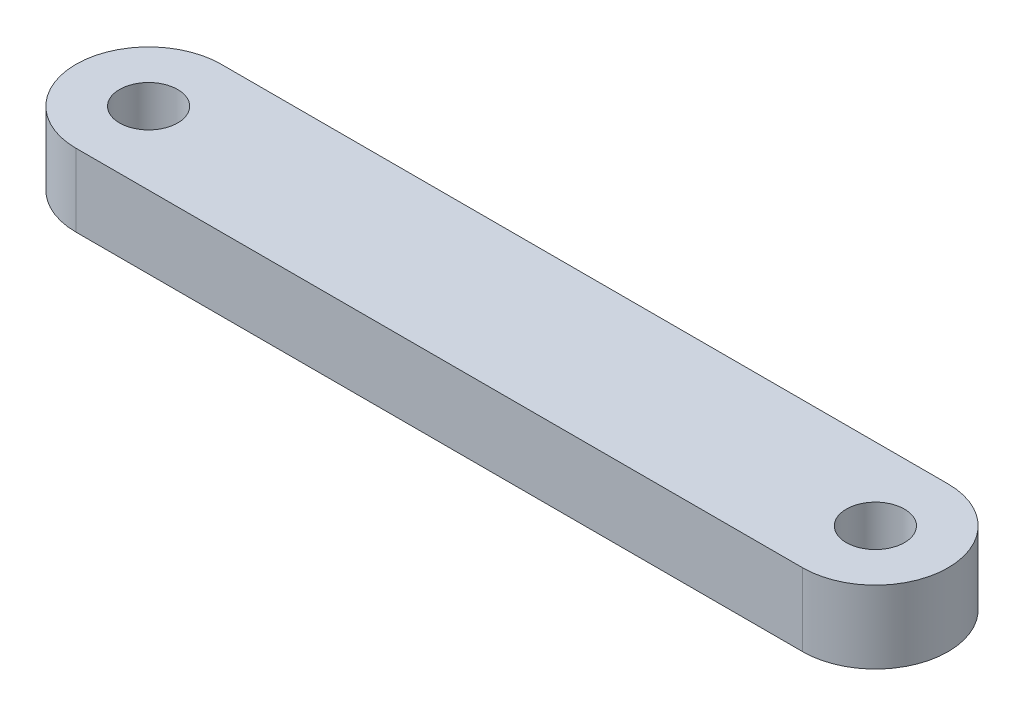
ISO-10303-21;
HEADER;
FILE_DESCRIPTION(('STEP AP214'),'2;1');
FILE_NAME('part.step','',(''),(''),'','','');
FILE_SCHEMA(('AUTOMOTIVE_DESIGN { 1 0 10303 214 1 1 1 1 }'));
ENDSEC;
DATA;
#1=APPLICATION_CONTEXT('core data for automotive mechanical design processes');
#2=APPLICATION_PROTOCOL_DEFINITION('international standard','automotive_design',2000,#1);
#3=PRODUCT_CONTEXT('',#1,'mechanical');
#4=PRODUCT('Part','Part','',(#3));
#5=PRODUCT_RELATED_PRODUCT_CATEGORY('part','',(#4));
#6=PRODUCT_DEFINITION_FORMATION('','',#4);
#7=PRODUCT_DEFINITION_CONTEXT('part definition',#1,'design');
#8=PRODUCT_DEFINITION('design','',#6,#7);
#9=PRODUCT_DEFINITION_SHAPE('','',#8);
#10=(LENGTH_UNIT() NAMED_UNIT(*) SI_UNIT(.MILLI.,.METRE.));
#11=(NAMED_UNIT(*) PLANE_ANGLE_UNIT() SI_UNIT($,.RADIAN.));
#12=(NAMED_UNIT(*) SI_UNIT($,.STERADIAN.) SOLID_ANGLE_UNIT());
#13=UNCERTAINTY_MEASURE_WITH_UNIT(LENGTH_MEASURE(1.E-05),#10,'distance_accuracy_value','');
#14=(GEOMETRIC_REPRESENTATION_CONTEXT(3) GLOBAL_UNCERTAINTY_ASSIGNED_CONTEXT((#13)) GLOBAL_UNIT_ASSIGNED_CONTEXT((#10,
#11,#12)) REPRESENTATION_CONTEXT('',''));
#15=CARTESIAN_POINT('',(0.,0.,0.));
#16=DIRECTION('',(0.,0.,1.));
#17=DIRECTION('',(1.,0.,0.));
#18=AXIS2_PLACEMENT_3D('',#15,#16,#17);
#19=CARTESIAN_POINT('',(0.,5.,-5.));
#20=DIRECTION('',(0.,-1.,0.));
#21=DIRECTION('',(0.,0.,-1.));
#22=AXIS2_PLACEMENT_3D('',#19,#20,#21);
#23=CYLINDRICAL_SURFACE('',#22,5.);
#24=CARTESIAN_POINT('',(0.,0.,-5.));
#25=DIRECTION('',(0.,1.,0.));
#26=DIRECTION('',(0.,0.,1.));
#27=AXIS2_PLACEMENT_3D('',#24,#25,#26);
#28=CIRCLE('',#27,5.);
#29=CARTESIAN_POINT('',(0.,0.,-10.));
#30=VERTEX_POINT('',#29);
#31=CARTESIAN_POINT('',(0.,0.,0.));
#32=VERTEX_POINT('',#31);
#33=EDGE_CURVE('E100',#30,#32,#28,.T.);
#34=ORIENTED_EDGE('',*,*,#33,.T.);
#35=DIRECTION('',(0.,-1.,0.));
#36=VECTOR('',#35,1.);
#37=CARTESIAN_POINT('',(0.,5.,0.));
#38=LINE('',#37,#36);
#39=CARTESIAN_POINT('',(0.,5.,0.));
#40=VERTEX_POINT('',#39);
#41=EDGE_CURVE('E11',#40,#32,#38,.T.);
#42=ORIENTED_EDGE('',*,*,#41,.F.);
#43=CARTESIAN_POINT('',(0.,5.,-5.));
#44=DIRECTION('',(0.,1.,0.));
#45=DIRECTION('',(0.,0.,1.));
#46=AXIS2_PLACEMENT_3D('',#43,#44,#45);
#47=CIRCLE('',#46,5.);
#48=CARTESIAN_POINT('',(0.,5.,-10.));
#49=VERTEX_POINT('',#48);
#50=EDGE_CURVE('E88',#49,#40,#47,.T.);
#51=ORIENTED_EDGE('',*,*,#50,.F.);
#52=DIRECTION('',(0.,-1.,0.));
#53=VECTOR('',#52,1.);
#54=CARTESIAN_POINT('',(0.,5.,-10.));
#55=LINE('',#54,#53);
#56=EDGE_CURVE('E96',#49,#30,#55,.T.);
#57=ORIENTED_EDGE('',*,*,#56,.T.);
#58=EDGE_LOOP('',(#34,#42,#51,#57));
#59=FACE_BOUND('',#58,.T.);
#60=ADVANCED_FACE('F37',(#59),#23,.T.);
#61=CARTESIAN_POINT('',(0.,5.,0.));
#62=DIRECTION('',(0.,0.,-1.));
#63=DIRECTION('',(-1.,0.,0.));
#64=AXIS2_PLACEMENT_3D('',#61,#62,#63);
#65=PLANE('',#64);
#66=DIRECTION('',(1.,0.,0.));
#67=VECTOR('',#66,1.);
#68=CARTESIAN_POINT('',(0.,0.,0.));
#69=LINE('',#68,#67);
#70=CARTESIAN_POINT('',(50.,0.,0.));
#71=VERTEX_POINT('',#70);
#72=EDGE_CURVE('E92',#32,#71,#69,.T.);
#73=ORIENTED_EDGE('',*,*,#72,.T.);
#74=DIRECTION('',(0.,-1.,0.));
#75=VECTOR('',#74,1.);
#76=CARTESIAN_POINT('',(50.,5.,0.));
#77=LINE('',#76,#75);
#78=CARTESIAN_POINT('',(50.,5.,0.));
#79=VERTEX_POINT('',#78);
#80=EDGE_CURVE('E45',#79,#71,#77,.T.);
#81=ORIENTED_EDGE('',*,*,#80,.F.);
#82=DIRECTION('',(1.,0.,0.));
#83=VECTOR('',#82,1.);
#84=CARTESIAN_POINT('',(0.,5.,0.));
#85=LINE('',#84,#83);
#86=EDGE_CURVE('E83',#40,#79,#85,.T.);
#87=ORIENTED_EDGE('',*,*,#86,.F.);
#88=ORIENTED_EDGE('',*,*,#41,.T.);
#89=EDGE_LOOP('',(#73,#81,#87,#88));
#90=FACE_BOUND('',#89,.T.);
#91=ADVANCED_FACE('F91',(#90),#65,.F.);
#92=CARTESIAN_POINT('',(50.,5.,-5.));
#93=DIRECTION('',(0.,-1.,0.));
#94=DIRECTION('',(0.,0.,-1.));
#95=AXIS2_PLACEMENT_3D('',#92,#93,#94);
#96=CYLINDRICAL_SURFACE('',#95,5.);
#97=CARTESIAN_POINT('',(50.,0.,-5.));
#98=DIRECTION('',(0.,1.,0.));
#99=DIRECTION('',(0.,0.,1.));
#100=AXIS2_PLACEMENT_3D('',#97,#98,#99);
#101=CIRCLE('',#100,5.);
#102=CARTESIAN_POINT('',(50.,0.,-10.));
#103=VERTEX_POINT('',#102);
#104=EDGE_CURVE('E70',#71,#103,#101,.T.);
#105=ORIENTED_EDGE('',*,*,#104,.T.);
#106=DIRECTION('',(0.,-1.,0.));
#107=VECTOR('',#106,1.);
#108=CARTESIAN_POINT('',(50.,5.,-10.));
#109=LINE('',#108,#107);
#110=CARTESIAN_POINT('',(50.,5.,-10.));
#111=VERTEX_POINT('',#110);
#112=EDGE_CURVE('E93',#111,#103,#109,.T.);
#113=ORIENTED_EDGE('',*,*,#112,.F.);
#114=CARTESIAN_POINT('',(50.,5.,-5.));
#115=DIRECTION('',(0.,1.,0.));
#116=DIRECTION('',(0.,0.,1.));
#117=AXIS2_PLACEMENT_3D('',#114,#115,#116);
#118=CIRCLE('',#117,5.);
#119=EDGE_CURVE('E86',#79,#111,#118,.T.);
#120=ORIENTED_EDGE('',*,*,#119,.F.);
#121=ORIENTED_EDGE('',*,*,#80,.T.);
#122=EDGE_LOOP('',(#105,#113,#120,#121));
#123=FACE_BOUND('',#122,.T.);
#124=ADVANCED_FACE('F94',(#123),#96,.T.);
#125=CARTESIAN_POINT('',(50.,5.,-10.));
#126=DIRECTION('',(0.,0.,1.));
#127=DIRECTION('',(1.,0.,0.));
#128=AXIS2_PLACEMENT_3D('',#125,#126,#127);
#129=PLANE('',#128);
#130=DIRECTION('',(-1.,0.,0.));
#131=VECTOR('',#130,1.);
#132=CARTESIAN_POINT('',(50.,0.,-10.));
#133=LINE('',#132,#131);
#134=EDGE_CURVE('E76',#103,#30,#133,.T.);
#135=ORIENTED_EDGE('',*,*,#134,.T.);
#136=ORIENTED_EDGE('',*,*,#56,.F.);
#137=DIRECTION('',(-1.,0.,0.));
#138=VECTOR('',#137,1.);
#139=CARTESIAN_POINT('',(50.,5.,-10.));
#140=LINE('',#139,#138);
#141=EDGE_CURVE('E53',#111,#49,#140,.T.);
#142=ORIENTED_EDGE('',*,*,#141,.F.);
#143=ORIENTED_EDGE('',*,*,#112,.T.);
#144=EDGE_LOOP('',(#135,#136,#142,#143));
#145=FACE_BOUND('',#144,.T.);
#146=ADVANCED_FACE('F108',(#145),#129,.F.);
#147=CARTESIAN_POINT('',(0.,5.,-5.));
#148=DIRECTION('',(0.,1.,0.));
#149=DIRECTION('',(0.,0.,1.));
#150=AXIS2_PLACEMENT_3D('',#147,#148,#149);
#151=PLANE('',#150);
#152=CARTESIAN_POINT('',(0.,5.,-5.));
#153=DIRECTION('',(0.,1.,0.));
#154=DIRECTION('',(0.,0.,1.));
#155=AXIS2_PLACEMENT_3D('',#152,#153,#154);
#156=CIRCLE('',#155,2.);
#157=CARTESIAN_POINT('',(0.,5.,-3.));
#158=VERTEX_POINT('',#157);
#159=EDGE_CURVE('E120',#158,#158,#156,.T.);
#160=ORIENTED_EDGE('',*,*,#159,.F.);
#161=EDGE_LOOP('',(#160));
#162=FACE_BOUND('',#161,.T.);
#163=CARTESIAN_POINT('',(50.,5.,-5.));
#164=DIRECTION('',(0.,1.,0.));
#165=DIRECTION('',(0.,0.,1.));
#166=AXIS2_PLACEMENT_3D('',#163,#164,#165);
#167=CIRCLE('',#166,2.);
#168=CARTESIAN_POINT('',(50.,5.,-3.));
#169=VERTEX_POINT('',#168);
#170=EDGE_CURVE('E117',#169,#169,#167,.T.);
#171=ORIENTED_EDGE('',*,*,#170,.F.);
#172=EDGE_LOOP('',(#171));
#173=FACE_BOUND('',#172,.T.);
#174=ORIENTED_EDGE('',*,*,#50,.T.);
#175=ORIENTED_EDGE('',*,*,#86,.T.);
#176=ORIENTED_EDGE('',*,*,#119,.T.);
#177=ORIENTED_EDGE('',*,*,#141,.T.);
#178=EDGE_LOOP('',(#174,#175,#176,#177));
#179=FACE_BOUND('',#178,.T.);
#180=ADVANCED_FACE('F84',(#162,#173,#179),#151,.T.);
#181=CARTESIAN_POINT('',(0.,0.,-5.));
#182=DIRECTION('',(0.,1.,0.));
#183=DIRECTION('',(0.,0.,1.));
#184=AXIS2_PLACEMENT_3D('',#181,#182,#183);
#185=PLANE('',#184);
#186=CARTESIAN_POINT('',(0.,0.,-5.));
#187=DIRECTION('',(0.,1.,0.));
#188=DIRECTION('',(0.,0.,1.));
#189=AXIS2_PLACEMENT_3D('',#186,#187,#188);
#190=CIRCLE('',#189,2.);
#191=CARTESIAN_POINT('',(0.,0.,-3.));
#192=VERTEX_POINT('',#191);
#193=EDGE_CURVE('E103',#192,#192,#190,.T.);
#194=ORIENTED_EDGE('',*,*,#193,.T.);
#195=EDGE_LOOP('',(#194));
#196=FACE_BOUND('',#195,.T.);
#197=CARTESIAN_POINT('',(50.,0.,-5.));
#198=DIRECTION('',(0.,1.,0.));
#199=DIRECTION('',(0.,0.,1.));
#200=AXIS2_PLACEMENT_3D('',#197,#198,#199);
#201=CIRCLE('',#200,2.);
#202=CARTESIAN_POINT('',(50.,0.,-3.));
#203=VERTEX_POINT('',#202);
#204=EDGE_CURVE('E114',#203,#203,#201,.T.);
#205=ORIENTED_EDGE('',*,*,#204,.T.);
#206=EDGE_LOOP('',(#205));
#207=FACE_BOUND('',#206,.T.);
#208=ORIENTED_EDGE('',*,*,#33,.F.);
#209=ORIENTED_EDGE('',*,*,#134,.F.);
#210=ORIENTED_EDGE('',*,*,#104,.F.);
#211=ORIENTED_EDGE('',*,*,#72,.F.);
#212=EDGE_LOOP('',(#208,#209,#210,#211));
#213=FACE_BOUND('',#212,.T.);
#214=ADVANCED_FACE('F111',(#196,#207,#213),#185,.F.);
#215=CARTESIAN_POINT('',(50.,0.,-5.));
#216=DIRECTION('',(0.,1.,0.));
#217=DIRECTION('',(0.,0.,1.));
#218=AXIS2_PLACEMENT_3D('',#215,#216,#217);
#219=CYLINDRICAL_SURFACE('',#218,2.);
#220=ORIENTED_EDGE('',*,*,#204,.F.);
#221=EDGE_LOOP('',(#220));
#222=FACE_BOUND('',#221,.T.);
#223=ORIENTED_EDGE('',*,*,#170,.T.);
#224=EDGE_LOOP('',(#223));
#225=FACE_BOUND('',#224,.T.);
#226=ADVANCED_FACE('F131',(#222,#225),#219,.F.);
#227=CARTESIAN_POINT('',(0.,0.,-5.));
#228=DIRECTION('',(0.,1.,0.));
#229=DIRECTION('',(0.,0.,1.));
#230=AXIS2_PLACEMENT_3D('',#227,#228,#229);
#231=CYLINDRICAL_SURFACE('',#230,2.);
#232=ORIENTED_EDGE('',*,*,#193,.F.);
#233=EDGE_LOOP('',(#232));
#234=FACE_BOUND('',#233,.T.);
#235=ORIENTED_EDGE('',*,*,#159,.T.);
#236=EDGE_LOOP('',(#235));
#237=FACE_BOUND('',#236,.T.);
#238=ADVANCED_FACE('F128',(#234,#237),#231,.F.);
#239=CLOSED_SHELL('',(#60,#91,#124,#146,#180,#214,#226,#238));
#240=MANIFOLD_SOLID_BREP('B2',#239);
#241=ADVANCED_BREP_SHAPE_REPRESENTATION('',(#18,#240),#14);
#242=SHAPE_DEFINITION_REPRESENTATION(#9,#241);
ENDSEC;
END-ISO-10303-21;
